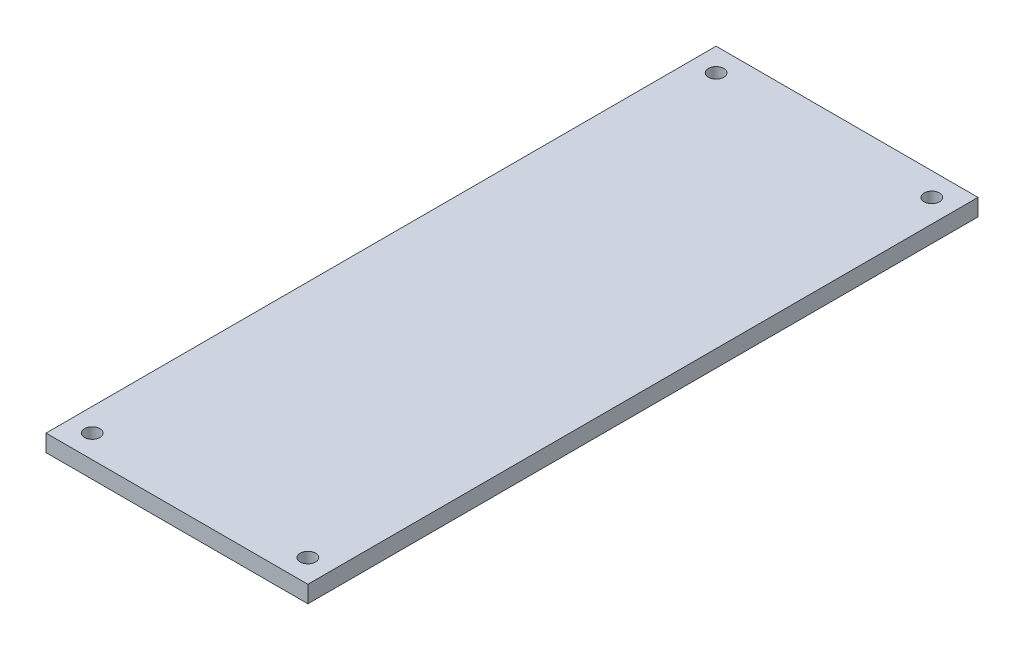
ISO-10303-21;
HEADER;
FILE_DESCRIPTION(('STEP AP214'),'2;1');
FILE_NAME('part.step','',(''),(''),'','','');
FILE_SCHEMA(('AUTOMOTIVE_DESIGN { 1 0 10303 214 1 1 1 1 }'));
ENDSEC;
DATA;
#1=APPLICATION_CONTEXT('core data for automotive mechanical design processes');
#2=APPLICATION_PROTOCOL_DEFINITION('international standard','automotive_design',2000,#1);
#3=PRODUCT_CONTEXT('',#1,'mechanical');
#4=PRODUCT('Part','Part','',(#3));
#5=PRODUCT_RELATED_PRODUCT_CATEGORY('part','',(#4));
#6=PRODUCT_DEFINITION_FORMATION('','',#4);
#7=PRODUCT_DEFINITION_CONTEXT('part definition',#1,'design');
#8=PRODUCT_DEFINITION('design','',#6,#7);
#9=PRODUCT_DEFINITION_SHAPE('','',#8);
#10=(LENGTH_UNIT() NAMED_UNIT(*) SI_UNIT(.MILLI.,.METRE.));
#11=(NAMED_UNIT(*) PLANE_ANGLE_UNIT() SI_UNIT($,.RADIAN.));
#12=(NAMED_UNIT(*) SI_UNIT($,.STERADIAN.) SOLID_ANGLE_UNIT());
#13=UNCERTAINTY_MEASURE_WITH_UNIT(LENGTH_MEASURE(1.E-05),#10,'distance_accuracy_value','');
#14=(GEOMETRIC_REPRESENTATION_CONTEXT(3) GLOBAL_UNCERTAINTY_ASSIGNED_CONTEXT((#13)) GLOBAL_UNIT_ASSIGNED_CONTEXT((#10,
#11,#12)) REPRESENTATION_CONTEXT('',''));
#15=CARTESIAN_POINT('',(0.,0.,0.));
#16=DIRECTION('',(0.,0.,1.));
#17=DIRECTION('',(1.,0.,0.));
#18=AXIS2_PLACEMENT_3D('',#15,#16,#17);
#19=CARTESIAN_POINT('',(0.,2.2,0.));
#20=DIRECTION('',(0.,-1.,0.));
#21=DIRECTION('',(0.,0.,-1.));
#22=AXIS2_PLACEMENT_3D('',#19,#20,#21);
#23=PLANE('',#22);
#24=DIRECTION('',(1.,0.,0.));
#25=VECTOR('',#24,1.);
#26=CARTESIAN_POINT('',(0.,2.2,0.));
#27=LINE('',#26,#25);
#28=CARTESIAN_POINT('',(0.,2.2,0.));
#29=VERTEX_POINT('',#28);
#30=CARTESIAN_POINT('',(34.,2.2,0.));
#31=VERTEX_POINT('',#30);
#32=EDGE_CURVE('E160',#29,#31,#27,.T.);
#33=ORIENTED_EDGE('',*,*,#32,.F.);
#34=DIRECTION('',(0.,0.,1.));
#35=VECTOR('',#34,1.);
#36=CARTESIAN_POINT('',(0.,2.2,0.));
#37=LINE('',#36,#35);
#38=CARTESIAN_POINT('',(0.,2.2,87.));
#39=VERTEX_POINT('',#38);
#40=EDGE_CURVE('E150',#29,#39,#37,.T.);
#41=ORIENTED_EDGE('',*,*,#40,.T.);
#42=DIRECTION('',(1.,0.,0.));
#43=VECTOR('',#42,1.);
#44=CARTESIAN_POINT('',(0.,2.2,87.));
#45=LINE('',#44,#43);
#46=CARTESIAN_POINT('',(34.,2.2,87.));
#47=VERTEX_POINT('',#46);
#48=EDGE_CURVE('E145',#39,#47,#45,.T.);
#49=ORIENTED_EDGE('',*,*,#48,.T.);
#50=DIRECTION('',(0.,0.,1.));
#51=VECTOR('',#50,1.);
#52=CARTESIAN_POINT('',(34.,2.2,0.));
#53=LINE('',#52,#51);
#54=EDGE_CURVE('E149',#31,#47,#53,.T.);
#55=ORIENTED_EDGE('',*,*,#54,.F.);
#56=EDGE_LOOP('',(#33,#41,#49,#55));
#57=FACE_BOUND('',#56,.T.);
#58=CARTESIAN_POINT('',(3.00000000000001,2.2,84.));
#59=DIRECTION('',(0.,1.,0.));
#60=DIRECTION('',(0.,0.,1.));
#61=AXIS2_PLACEMENT_3D('',#58,#59,#60);
#62=CIRCLE('',#61,1.);
#63=CARTESIAN_POINT('',(3.00000000000001,2.2,85.));
#64=VERTEX_POINT('',#63);
#65=EDGE_CURVE('E170',#64,#64,#62,.T.);
#66=ORIENTED_EDGE('',*,*,#65,.F.);
#67=EDGE_LOOP('',(#66));
#68=FACE_BOUND('',#67,.T.);
#69=CARTESIAN_POINT('',(31.,2.2,84.));
#70=DIRECTION('',(0.,1.,0.));
#71=DIRECTION('',(0.,0.,1.));
#72=AXIS2_PLACEMENT_3D('',#69,#70,#71);
#73=CIRCLE('',#72,0.999999999999998);
#74=CARTESIAN_POINT('',(31.,2.2,85.));
#75=VERTEX_POINT('',#74);
#76=EDGE_CURVE('E213',#75,#75,#73,.T.);
#77=ORIENTED_EDGE('',*,*,#76,.F.);
#78=EDGE_LOOP('',(#77));
#79=FACE_BOUND('',#78,.T.);
#80=CARTESIAN_POINT('',(3.,2.2,3.));
#81=DIRECTION('',(0.,1.,0.));
#82=DIRECTION('',(0.,0.,1.));
#83=AXIS2_PLACEMENT_3D('',#80,#81,#82);
#84=CIRCLE('',#83,0.999999999999999);
#85=CARTESIAN_POINT('',(3.,2.2,4.));
#86=VERTEX_POINT('',#85);
#87=EDGE_CURVE('E220',#86,#86,#84,.T.);
#88=ORIENTED_EDGE('',*,*,#87,.F.);
#89=EDGE_LOOP('',(#88));
#90=FACE_BOUND('',#89,.T.);
#91=CARTESIAN_POINT('',(31.,2.2,3.));
#92=DIRECTION('',(0.,1.,0.));
#93=DIRECTION('',(0.,0.,1.));
#94=AXIS2_PLACEMENT_3D('',#91,#92,#93);
#95=CIRCLE('',#94,0.999999999999998);
#96=CARTESIAN_POINT('',(31.,2.2,4.));
#97=VERTEX_POINT('',#96);
#98=EDGE_CURVE('E225',#97,#97,#95,.T.);
#99=ORIENTED_EDGE('',*,*,#98,.F.);
#100=EDGE_LOOP('',(#99));
#101=FACE_BOUND('',#100,.T.);
#102=ADVANCED_FACE('F99',(#57,#68,#79,#90,#101),#23,.F.);
#103=CARTESIAN_POINT('',(0.,0.,0.));
#104=DIRECTION('',(0.,-1.,0.));
#105=DIRECTION('',(0.,0.,-1.));
#106=AXIS2_PLACEMENT_3D('',#103,#104,#105);
#107=PLANE('',#106);
#108=CARTESIAN_POINT('',(3.,0.,3.));
#109=DIRECTION('',(0.,1.,0.));
#110=DIRECTION('',(0.,0.,1.));
#111=AXIS2_PLACEMENT_3D('',#108,#109,#110);
#112=CIRCLE('',#111,0.999999999999999);
#113=CARTESIAN_POINT('',(3.,0.,4.));
#114=VERTEX_POINT('',#113);
#115=EDGE_CURVE('E222',#114,#114,#112,.T.);
#116=ORIENTED_EDGE('',*,*,#115,.T.);
#117=EDGE_LOOP('',(#116));
#118=FACE_BOUND('',#117,.T.);
#119=CARTESIAN_POINT('',(3.00000000000001,0.,84.));
#120=DIRECTION('',(0.,1.,0.));
#121=DIRECTION('',(0.,0.,1.));
#122=AXIS2_PLACEMENT_3D('',#119,#120,#121);
#123=CIRCLE('',#122,1.);
#124=CARTESIAN_POINT('',(3.00000000000001,0.,85.));
#125=VERTEX_POINT('',#124);
#126=EDGE_CURVE('E211',#125,#125,#123,.T.);
#127=ORIENTED_EDGE('',*,*,#126,.T.);
#128=EDGE_LOOP('',(#127));
#129=FACE_BOUND('',#128,.T.);
#130=DIRECTION('',(1.,0.,0.));
#131=VECTOR('',#130,1.);
#132=CARTESIAN_POINT('',(0.,0.,0.));
#133=LINE('',#132,#131);
#134=CARTESIAN_POINT('',(0.,0.,0.));
#135=VERTEX_POINT('',#134);
#136=CARTESIAN_POINT('',(34.,0.,0.));
#137=VERTEX_POINT('',#136);
#138=EDGE_CURVE('E166',#135,#137,#133,.T.);
#139=ORIENTED_EDGE('',*,*,#138,.T.);
#140=DIRECTION('',(0.,0.,1.));
#141=VECTOR('',#140,1.);
#142=CARTESIAN_POINT('',(34.,0.,0.));
#143=LINE('',#142,#141);
#144=CARTESIAN_POINT('',(34.,0.,87.));
#145=VERTEX_POINT('',#144);
#146=EDGE_CURVE('E169',#137,#145,#143,.T.);
#147=ORIENTED_EDGE('',*,*,#146,.T.);
#148=DIRECTION('',(1.,0.,0.));
#149=VECTOR('',#148,1.);
#150=CARTESIAN_POINT('',(0.,0.,87.));
#151=LINE('',#150,#149);
#152=CARTESIAN_POINT('',(0.,0.,87.));
#153=VERTEX_POINT('',#152);
#154=EDGE_CURVE('E157',#153,#145,#151,.T.);
#155=ORIENTED_EDGE('',*,*,#154,.F.);
#156=DIRECTION('',(0.,0.,1.));
#157=VECTOR('',#156,1.);
#158=CARTESIAN_POINT('',(0.,0.,0.));
#159=LINE('',#158,#157);
#160=EDGE_CURVE('E133',#135,#153,#159,.T.);
#161=ORIENTED_EDGE('',*,*,#160,.F.);
#162=EDGE_LOOP('',(#139,#147,#155,#161));
#163=FACE_BOUND('',#162,.T.);
#164=CARTESIAN_POINT('',(31.,0.,84.));
#165=DIRECTION('',(0.,1.,0.));
#166=DIRECTION('',(0.,0.,1.));
#167=AXIS2_PLACEMENT_3D('',#164,#165,#166);
#168=CIRCLE('',#167,0.999999999999998);
#169=CARTESIAN_POINT('',(31.,0.,85.));
#170=VERTEX_POINT('',#169);
#171=EDGE_CURVE('E216',#170,#170,#168,.T.);
#172=ORIENTED_EDGE('',*,*,#171,.T.);
#173=EDGE_LOOP('',(#172));
#174=FACE_BOUND('',#173,.T.);
#175=CARTESIAN_POINT('',(31.,0.,3.));
#176=DIRECTION('',(0.,1.,0.));
#177=DIRECTION('',(0.,0.,1.));
#178=AXIS2_PLACEMENT_3D('',#175,#176,#177);
#179=CIRCLE('',#178,0.999999999999998);
#180=CARTESIAN_POINT('',(31.,0.,4.));
#181=VERTEX_POINT('',#180);
#182=EDGE_CURVE('E228',#181,#181,#179,.T.);
#183=ORIENTED_EDGE('',*,*,#182,.T.);
#184=EDGE_LOOP('',(#183));
#185=FACE_BOUND('',#184,.T.);
#186=ADVANCED_FACE('F175',(#118,#129,#163,#174,#185),#107,.T.);
#187=CARTESIAN_POINT('',(0.,2.2,0.));
#188=DIRECTION('',(0.,0.,-1.));
#189=DIRECTION('',(-1.,0.,0.));
#190=AXIS2_PLACEMENT_3D('',#187,#188,#189);
#191=PLANE('',#190);
#192=ORIENTED_EDGE('',*,*,#138,.F.);
#193=DIRECTION('',(0.,-1.,0.));
#194=VECTOR('',#193,1.);
#195=CARTESIAN_POINT('',(0.,2.2,0.));
#196=LINE('',#195,#194);
#197=EDGE_CURVE('E12',#29,#135,#196,.T.);
#198=ORIENTED_EDGE('',*,*,#197,.F.);
#199=ORIENTED_EDGE('',*,*,#32,.T.);
#200=DIRECTION('',(0.,-1.,0.));
#201=VECTOR('',#200,1.);
#202=CARTESIAN_POINT('',(34.,2.2,0.));
#203=LINE('',#202,#201);
#204=EDGE_CURVE('E103',#31,#137,#203,.T.);
#205=ORIENTED_EDGE('',*,*,#204,.T.);
#206=EDGE_LOOP('',(#192,#198,#199,#205));
#207=FACE_BOUND('',#206,.T.);
#208=ADVANCED_FACE('F101',(#207),#191,.T.);
#209=CARTESIAN_POINT('',(0.,2.2,0.));
#210=DIRECTION('',(1.,0.,0.));
#211=DIRECTION('',(0.,0.,-1.));
#212=AXIS2_PLACEMENT_3D('',#209,#210,#211);
#213=PLANE('',#212);
#214=ORIENTED_EDGE('',*,*,#160,.T.);
#215=DIRECTION('',(0.,-1.,0.));
#216=VECTOR('',#215,1.);
#217=CARTESIAN_POINT('',(0.,2.2,87.));
#218=LINE('',#217,#216);
#219=EDGE_CURVE('E109',#39,#153,#218,.T.);
#220=ORIENTED_EDGE('',*,*,#219,.F.);
#221=ORIENTED_EDGE('',*,*,#40,.F.);
#222=ORIENTED_EDGE('',*,*,#197,.T.);
#223=EDGE_LOOP('',(#214,#220,#221,#222));
#224=FACE_BOUND('',#223,.T.);
#225=ADVANCED_FACE('F178',(#224),#213,.F.);
#226=CARTESIAN_POINT('',(0.,2.2,87.));
#227=DIRECTION('',(0.,0.,-1.));
#228=DIRECTION('',(-1.,0.,0.));
#229=AXIS2_PLACEMENT_3D('',#226,#227,#228);
#230=PLANE('',#229);
#231=ORIENTED_EDGE('',*,*,#154,.T.);
#232=DIRECTION('',(0.,-1.,0.));
#233=VECTOR('',#232,1.);
#234=CARTESIAN_POINT('',(34.,2.2,87.));
#235=LINE('',#234,#233);
#236=EDGE_CURVE('E154',#47,#145,#235,.T.);
#237=ORIENTED_EDGE('',*,*,#236,.F.);
#238=ORIENTED_EDGE('',*,*,#48,.F.);
#239=ORIENTED_EDGE('',*,*,#219,.T.);
#240=EDGE_LOOP('',(#231,#237,#238,#239));
#241=FACE_BOUND('',#240,.T.);
#242=ADVANCED_FACE('F155',(#241),#230,.F.);
#243=CARTESIAN_POINT('',(34.,2.2,0.));
#244=DIRECTION('',(1.,0.,0.));
#245=DIRECTION('',(0.,0.,-1.));
#246=AXIS2_PLACEMENT_3D('',#243,#244,#245);
#247=PLANE('',#246);
#248=ORIENTED_EDGE('',*,*,#146,.F.);
#249=ORIENTED_EDGE('',*,*,#204,.F.);
#250=ORIENTED_EDGE('',*,*,#54,.T.);
#251=ORIENTED_EDGE('',*,*,#236,.T.);
#252=EDGE_LOOP('',(#248,#249,#250,#251));
#253=FACE_BOUND('',#252,.T.);
#254=ADVANCED_FACE('F159',(#253),#247,.T.);
#255=CARTESIAN_POINT('',(3.00000000000001,2.2,84.));
#256=DIRECTION('',(0.,-1.,0.));
#257=DIRECTION('',(0.,0.,-1.));
#258=AXIS2_PLACEMENT_3D('',#255,#256,#257);
#259=CYLINDRICAL_SURFACE('',#258,1.);
#260=ORIENTED_EDGE('',*,*,#65,.T.);
#261=EDGE_LOOP('',(#260));
#262=FACE_BOUND('',#261,.T.);
#263=ORIENTED_EDGE('',*,*,#126,.F.);
#264=EDGE_LOOP('',(#263));
#265=FACE_BOUND('',#264,.T.);
#266=ADVANCED_FACE('F191',(#262,#265),#259,.F.);
#267=CARTESIAN_POINT('',(31.,2.2,84.));
#268=DIRECTION('',(0.,-1.,0.));
#269=DIRECTION('',(0.,0.,-1.));
#270=AXIS2_PLACEMENT_3D('',#267,#268,#269);
#271=CYLINDRICAL_SURFACE('',#270,0.999999999999998);
#272=ORIENTED_EDGE('',*,*,#76,.T.);
#273=EDGE_LOOP('',(#272));
#274=FACE_BOUND('',#273,.T.);
#275=ORIENTED_EDGE('',*,*,#171,.F.);
#276=EDGE_LOOP('',(#275));
#277=FACE_BOUND('',#276,.T.);
#278=ADVANCED_FACE('F199',(#274,#277),#271,.F.);
#279=CARTESIAN_POINT('',(3.,2.2,3.));
#280=DIRECTION('',(0.,-1.,0.));
#281=DIRECTION('',(0.,0.,-1.));
#282=AXIS2_PLACEMENT_3D('',#279,#280,#281);
#283=CYLINDRICAL_SURFACE('',#282,0.999999999999999);
#284=ORIENTED_EDGE('',*,*,#87,.T.);
#285=EDGE_LOOP('',(#284));
#286=FACE_BOUND('',#285,.T.);
#287=ORIENTED_EDGE('',*,*,#115,.F.);
#288=EDGE_LOOP('',(#287));
#289=FACE_BOUND('',#288,.T.);
#290=ADVANCED_FACE('F204',(#286,#289),#283,.F.);
#291=CARTESIAN_POINT('',(31.,2.2,3.));
#292=DIRECTION('',(0.,-1.,0.));
#293=DIRECTION('',(0.,0.,-1.));
#294=AXIS2_PLACEMENT_3D('',#291,#292,#293);
#295=CYLINDRICAL_SURFACE('',#294,0.999999999999998);
#296=ORIENTED_EDGE('',*,*,#98,.T.);
#297=EDGE_LOOP('',(#296));
#298=FACE_BOUND('',#297,.T.);
#299=ORIENTED_EDGE('',*,*,#182,.F.);
#300=EDGE_LOOP('',(#299));
#301=FACE_BOUND('',#300,.T.);
#302=ADVANCED_FACE('F234',(#298,#301),#295,.F.);
#303=CLOSED_SHELL('',(#102,#186,#208,#225,#242,#254,#266,#278,#290,#302));
#304=MANIFOLD_SOLID_BREP('B2',#303);
#305=ADVANCED_BREP_SHAPE_REPRESENTATION('',(#18,#304),#14);
#306=SHAPE_DEFINITION_REPRESENTATION(#9,#305);
ENDSEC;
END-ISO-10303-21;
